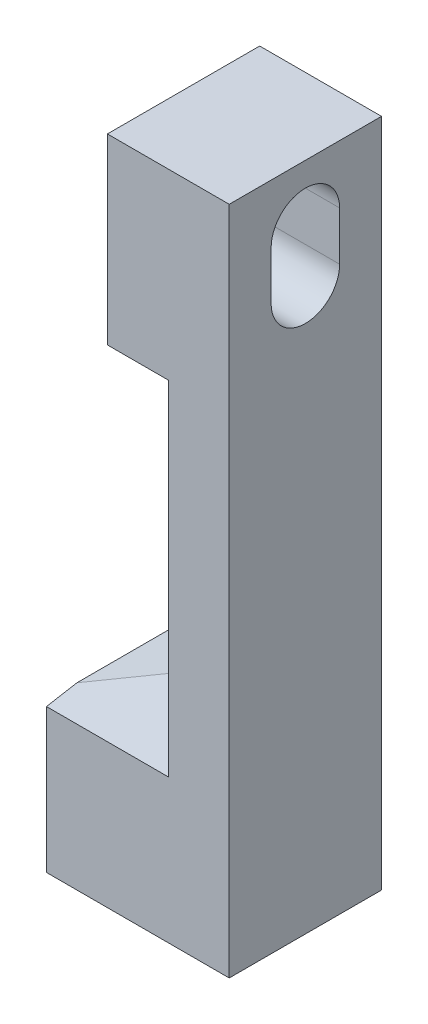
ISO-10303-21;
HEADER;
FILE_DESCRIPTION(('STEP AP214'),'2;1');
FILE_NAME('part.step','',(''),(''),'','','');
FILE_SCHEMA(('AUTOMOTIVE_DESIGN { 1 0 10303 214 1 1 1 1 }'));
ENDSEC;
DATA;
#1=APPLICATION_CONTEXT('core data for automotive mechanical design processes');
#2=APPLICATION_PROTOCOL_DEFINITION('international standard','automotive_design',2000,#1);
#3=PRODUCT_CONTEXT('',#1,'mechanical');
#4=PRODUCT('Part','Part','',(#3));
#5=PRODUCT_RELATED_PRODUCT_CATEGORY('part','',(#4));
#6=PRODUCT_DEFINITION_FORMATION('','',#4);
#7=PRODUCT_DEFINITION_CONTEXT('part definition',#1,'design');
#8=PRODUCT_DEFINITION('design','',#6,#7);
#9=PRODUCT_DEFINITION_SHAPE('','',#8);
#10=(LENGTH_UNIT() NAMED_UNIT(*) SI_UNIT(.MILLI.,.METRE.));
#11=(NAMED_UNIT(*) PLANE_ANGLE_UNIT() SI_UNIT($,.RADIAN.));
#12=(NAMED_UNIT(*) SI_UNIT($,.STERADIAN.) SOLID_ANGLE_UNIT());
#13=UNCERTAINTY_MEASURE_WITH_UNIT(LENGTH_MEASURE(1.E-05),#10,'distance_accuracy_value','');
#14=(GEOMETRIC_REPRESENTATION_CONTEXT(3) GLOBAL_UNCERTAINTY_ASSIGNED_CONTEXT((#13)) GLOBAL_UNIT_ASSIGNED_CONTEXT((#10,
#11,#12)) REPRESENTATION_CONTEXT('',''));
#15=CARTESIAN_POINT('',(0.,0.,0.));
#16=DIRECTION('',(0.,0.,1.));
#17=DIRECTION('',(1.,0.,0.));
#18=AXIS2_PLACEMENT_3D('',#15,#16,#17);
#19=CARTESIAN_POINT('',(0.,0.,0.));
#20=DIRECTION('',(1.,0.,0.));
#21=DIRECTION('',(0.,0.,-1.));
#22=AXIS2_PLACEMENT_3D('',#19,#20,#21);
#23=PLANE('',#22);
#24=DIRECTION('',(0.,1.,0.));
#25=VECTOR('',#24,1.);
#26=CARTESIAN_POINT('',(0.,34.925,-7.93749999999999));
#27=LINE('',#26,#25);
#28=CARTESIAN_POINT('',(0.,-17.145,-7.9375));
#29=VERTEX_POINT('',#28);
#30=CARTESIAN_POINT('',(0.,18.6741908187469,-7.9375));
#31=VERTEX_POINT('',#30);
#32=EDGE_CURVE('E204',#29,#31,#27,.T.);
#33=ORIENTED_EDGE('',*,*,#32,.F.);
#34=DIRECTION('',(0.,0.173648177666927,-0.984807753012208));
#35=VECTOR('',#34,1.);
#36=CARTESIAN_POINT('',(0.,-19.9441908187468,7.93750000000001));
#37=LINE('',#36,#35);
#38=CARTESIAN_POINT('',(0.,-19.9441908187468,7.93750000000001));
#39=VERTEX_POINT('',#38);
#40=EDGE_CURVE('E169',#39,#29,#37,.T.);
#41=ORIENTED_EDGE('',*,*,#40,.F.);
#42=DIRECTION('',(0.,-1.,0.));
#43=VECTOR('',#42,1.);
#44=CARTESIAN_POINT('',(0.,34.925,7.93750000000001));
#45=LINE('',#44,#43);
#46=CARTESIAN_POINT('',(0.,15.875,7.93750000000001));
#47=VERTEX_POINT('',#46);
#48=EDGE_CURVE('E209',#47,#39,#45,.T.);
#49=ORIENTED_EDGE('',*,*,#48,.F.);
#50=DIRECTION('',(0.,-0.173648177666934,0.984807753012207));
#51=VECTOR('',#50,1.);
#52=CARTESIAN_POINT('',(0.,18.6741908187469,-7.9375));
#53=LINE('',#52,#51);
#54=EDGE_CURVE('E185',#31,#47,#53,.T.);
#55=ORIENTED_EDGE('',*,*,#54,.F.);
#56=EDGE_LOOP('',(#33,#41,#49,#55));
#57=FACE_BOUND('',#56,.T.);
#58=ADVANCED_FACE('F37',(#57),#23,.F.);
#59=CARTESIAN_POINT('',(6.35,34.925,-7.93749999999999));
#60=DIRECTION('',(0.,0.,1.));
#61=DIRECTION('',(0.,-1.,0.));
#62=AXIS2_PLACEMENT_3D('',#59,#60,#61);
#63=PLANE('',#62);
#64=DIRECTION('',(0.,-1.,0.));
#65=VECTOR('',#64,1.);
#66=CARTESIAN_POINT('',(-12.7,-17.145,-7.9375));
#67=LINE('',#66,#65);
#68=CARTESIAN_POINT('',(-12.7,-19.3843526549974,-7.9375));
#69=VERTEX_POINT('',#68);
#70=CARTESIAN_POINT('',(-12.7,-34.925,-7.9375));
#71=VERTEX_POINT('',#70);
#72=EDGE_CURVE('E173',#69,#71,#67,.T.);
#73=ORIENTED_EDGE('',*,*,#72,.F.);
#74=DIRECTION('',(-0.984807753012209,-0.173648177666923,0.));
#75=VECTOR('',#74,1.);
#76=CARTESIAN_POINT('',(-12.7,-19.3843526549974,-7.9375));
#77=LINE('',#76,#75);
#78=EDGE_CURVE('E161',#29,#69,#77,.T.);
#79=ORIENTED_EDGE('',*,*,#78,.F.);
#80=ORIENTED_EDGE('',*,*,#32,.T.);
#81=DIRECTION('',(1.,0.,0.));
#82=VECTOR('',#81,1.);
#83=CARTESIAN_POINT('',(-6.35,18.6741908187469,-7.9375));
#84=LINE('',#83,#82);
#85=CARTESIAN_POINT('',(-6.35,18.6741908187469,-7.9375));
#86=VERTEX_POINT('',#85);
#87=EDGE_CURVE('E201',#86,#31,#84,.T.);
#88=ORIENTED_EDGE('',*,*,#87,.F.);
#89=DIRECTION('',(0.,-1.,0.));
#90=VECTOR('',#89,1.);
#91=CARTESIAN_POINT('',(-6.35,34.925,-7.9375));
#92=LINE('',#91,#90);
#93=CARTESIAN_POINT('',(-6.35,34.925,-7.9375));
#94=VERTEX_POINT('',#93);
#95=EDGE_CURVE('E192',#94,#86,#92,.T.);
#96=ORIENTED_EDGE('',*,*,#95,.F.);
#97=DIRECTION('',(-1.,0.,0.));
#98=VECTOR('',#97,1.);
#99=CARTESIAN_POINT('',(6.35,34.925,-7.93749999999999));
#100=LINE('',#99,#98);
#101=CARTESIAN_POINT('',(6.35,34.925,-7.93749999999999));
#102=VERTEX_POINT('',#101);
#103=EDGE_CURVE('E45',#102,#94,#100,.T.);
#104=ORIENTED_EDGE('',*,*,#103,.F.);
#105=DIRECTION('',(0.,1.,0.));
#106=VECTOR('',#105,1.);
#107=CARTESIAN_POINT('',(6.35,34.925,-7.93749999999999));
#108=LINE('',#107,#106);
#109=CARTESIAN_POINT('',(6.35,-34.925,-7.9375));
#110=VERTEX_POINT('',#109);
#111=EDGE_CURVE('E205',#110,#102,#108,.T.);
#112=ORIENTED_EDGE('',*,*,#111,.F.);
#113=DIRECTION('',(-1.,0.,0.));
#114=VECTOR('',#113,1.);
#115=CARTESIAN_POINT('',(6.35,-34.925,-7.9375));
#116=LINE('',#115,#114);
#117=EDGE_CURVE('E215',#110,#71,#116,.T.);
#118=ORIENTED_EDGE('',*,*,#117,.T.);
#119=EDGE_LOOP('',(#73,#79,#80,#88,#96,#104,#112,#118));
#120=FACE_BOUND('',#119,.T.);
#121=ADVANCED_FACE('F39',(#120),#63,.F.);
#122=CARTESIAN_POINT('',(6.35,34.925,7.93750000000001));
#123=DIRECTION('',(0.,-1.,0.));
#124=DIRECTION('',(0.,0.,-1.));
#125=AXIS2_PLACEMENT_3D('',#122,#123,#124);
#126=PLANE('',#125);
#127=ORIENTED_EDGE('',*,*,#103,.T.);
#128=DIRECTION('',(0.,0.,-1.));
#129=VECTOR('',#128,1.);
#130=CARTESIAN_POINT('',(-6.35,34.925,7.93750000000001));
#131=LINE('',#130,#129);
#132=CARTESIAN_POINT('',(-6.35,34.925,7.93750000000001));
#133=VERTEX_POINT('',#132);
#134=EDGE_CURVE('E189',#133,#94,#131,.T.);
#135=ORIENTED_EDGE('',*,*,#134,.F.);
#136=DIRECTION('',(-1.,0.,0.));
#137=VECTOR('',#136,1.);
#138=CARTESIAN_POINT('',(6.35,34.925,7.93750000000001));
#139=LINE('',#138,#137);
#140=CARTESIAN_POINT('',(6.35,34.925,7.93750000000001));
#141=VERTEX_POINT('',#140);
#142=EDGE_CURVE('E222',#141,#133,#139,.T.);
#143=ORIENTED_EDGE('',*,*,#142,.F.);
#144=DIRECTION('',(0.,0.,1.));
#145=VECTOR('',#144,1.);
#146=CARTESIAN_POINT('',(6.35,34.925,7.93750000000001));
#147=LINE('',#146,#145);
#148=EDGE_CURVE('E208',#102,#141,#147,.T.);
#149=ORIENTED_EDGE('',*,*,#148,.F.);
#150=EDGE_LOOP('',(#127,#135,#143,#149));
#151=FACE_BOUND('',#150,.T.);
#152=ADVANCED_FACE('F226',(#151),#126,.F.);
#153=CARTESIAN_POINT('',(6.35,34.925,7.93750000000001));
#154=DIRECTION('',(0.,0.,-1.));
#155=DIRECTION('',(0.,1.,0.));
#156=AXIS2_PLACEMENT_3D('',#153,#154,#155);
#157=PLANE('',#156);
#158=ORIENTED_EDGE('',*,*,#142,.T.);
#159=DIRECTION('',(0.,1.,0.));
#160=VECTOR('',#159,1.);
#161=CARTESIAN_POINT('',(-6.35,34.925,7.93750000000001));
#162=LINE('',#161,#160);
#163=CARTESIAN_POINT('',(-6.35,15.875,7.93750000000001));
#164=VERTEX_POINT('',#163);
#165=EDGE_CURVE('E186',#164,#133,#162,.T.);
#166=ORIENTED_EDGE('',*,*,#165,.F.);
#167=DIRECTION('',(1.,0.,0.));
#168=VECTOR('',#167,1.);
#169=CARTESIAN_POINT('',(-6.35,15.875,7.93750000000001));
#170=LINE('',#169,#168);
#171=EDGE_CURVE('E196',#164,#47,#170,.T.);
#172=ORIENTED_EDGE('',*,*,#171,.T.);
#173=ORIENTED_EDGE('',*,*,#48,.T.);
#174=DIRECTION('',(1.,0.,0.));
#175=VECTOR('',#174,1.);
#176=CARTESIAN_POINT('',(-12.7,-19.9441908187468,7.93750000000001));
#177=LINE('',#176,#175);
#178=CARTESIAN_POINT('',(-12.7,-19.9441908187468,7.93750000000001));
#179=VERTEX_POINT('',#178);
#180=EDGE_CURVE('E180',#179,#39,#177,.T.);
#181=ORIENTED_EDGE('',*,*,#180,.F.);
#182=DIRECTION('',(0.,1.,0.));
#183=VECTOR('',#182,1.);
#184=CARTESIAN_POINT('',(-12.7,-34.925,7.9375));
#185=LINE('',#184,#183);
#186=CARTESIAN_POINT('',(-12.7,-34.925,7.9375));
#187=VERTEX_POINT('',#186);
#188=EDGE_CURVE('E178',#187,#179,#185,.T.);
#189=ORIENTED_EDGE('',*,*,#188,.F.);
#190=DIRECTION('',(-1.,0.,0.));
#191=VECTOR('',#190,1.);
#192=CARTESIAN_POINT('',(6.35,-34.925,7.9375));
#193=LINE('',#192,#191);
#194=CARTESIAN_POINT('',(6.35,-34.925,7.9375));
#195=VERTEX_POINT('',#194);
#196=EDGE_CURVE('E220',#195,#187,#193,.T.);
#197=ORIENTED_EDGE('',*,*,#196,.F.);
#198=DIRECTION('',(0.,-1.,0.));
#199=VECTOR('',#198,1.);
#200=CARTESIAN_POINT('',(6.35,34.925,7.93750000000001));
#201=LINE('',#200,#199);
#202=EDGE_CURVE('E211',#141,#195,#201,.T.);
#203=ORIENTED_EDGE('',*,*,#202,.F.);
#204=EDGE_LOOP('',(#158,#166,#172,#173,#181,#189,#197,#203));
#205=FACE_BOUND('',#204,.T.);
#206=ADVANCED_FACE('F244',(#205),#157,.F.);
#207=CARTESIAN_POINT('',(6.35,-34.925,7.9375));
#208=DIRECTION('',(0.,1.,0.));
#209=DIRECTION('',(0.,0.,1.));
#210=AXIS2_PLACEMENT_3D('',#207,#208,#209);
#211=PLANE('',#210);
#212=ORIENTED_EDGE('',*,*,#196,.T.);
#213=DIRECTION('',(0.,0.,1.));
#214=VECTOR('',#213,1.);
#215=CARTESIAN_POINT('',(-12.7,-34.925,-7.9375));
#216=LINE('',#215,#214);
#217=EDGE_CURVE('E175',#71,#187,#216,.T.);
#218=ORIENTED_EDGE('',*,*,#217,.F.);
#219=ORIENTED_EDGE('',*,*,#117,.F.);
#220=DIRECTION('',(0.,0.,-1.));
#221=VECTOR('',#220,1.);
#222=CARTESIAN_POINT('',(6.35,-34.925,7.9375));
#223=LINE('',#222,#221);
#224=EDGE_CURVE('E213',#195,#110,#223,.T.);
#225=ORIENTED_EDGE('',*,*,#224,.F.);
#226=EDGE_LOOP('',(#212,#218,#219,#225));
#227=FACE_BOUND('',#226,.T.);
#228=ADVANCED_FACE('F252',(#227),#211,.F.);
#229=CARTESIAN_POINT('',(6.35,0.,0.));
#230=DIRECTION('',(1.,0.,0.));
#231=DIRECTION('',(0.,0.,-1.));
#232=AXIS2_PLACEMENT_3D('',#229,#230,#231);
#233=PLANE('',#232);
#234=CARTESIAN_POINT('',(6.35,28.8417379890378,0.));
#235=DIRECTION('',(-1.,0.,0.));
#236=DIRECTION('',(0.,0.,1.));
#237=AXIS2_PLACEMENT_3D('',#234,#235,#236);
#238=CIRCLE('',#237,3.5687);
#239=CARTESIAN_POINT('',(6.35,28.8417379890378,3.5687));
#240=VERTEX_POINT('',#239);
#241=CARTESIAN_POINT('',(6.35,28.8417379890378,-3.5687));
#242=VERTEX_POINT('',#241);
#243=EDGE_CURVE('E130',#240,#242,#238,.T.);
#244=ORIENTED_EDGE('',*,*,#243,.T.);
#245=DIRECTION('',(0.,-1.,0.));
#246=VECTOR('',#245,1.);
#247=CARTESIAN_POINT('',(6.35,28.8417379890378,-3.5687));
#248=LINE('',#247,#246);
#249=CARTESIAN_POINT('',(6.35,23.7617379890378,-3.5687));
#250=VERTEX_POINT('',#249);
#251=EDGE_CURVE('E139',#242,#250,#248,.T.);
#252=ORIENTED_EDGE('',*,*,#251,.T.);
#253=CARTESIAN_POINT('',(6.35,23.7617379890378,0.));
#254=DIRECTION('',(-1.,0.,0.));
#255=DIRECTION('',(0.,0.,1.));
#256=AXIS2_PLACEMENT_3D('',#253,#254,#255);
#257=CIRCLE('',#256,3.5687);
#258=CARTESIAN_POINT('',(6.35,23.7617379890378,3.5687));
#259=VERTEX_POINT('',#258);
#260=EDGE_CURVE('E52',#250,#259,#257,.T.);
#261=ORIENTED_EDGE('',*,*,#260,.T.);
#262=DIRECTION('',(0.,1.,0.));
#263=VECTOR('',#262,1.);
#264=CARTESIAN_POINT('',(6.35,28.8417379890378,3.5687));
#265=LINE('',#264,#263);
#266=EDGE_CURVE('E136',#259,#240,#265,.T.);
#267=ORIENTED_EDGE('',*,*,#266,.T.);
#268=EDGE_LOOP('',(#244,#252,#261,#267));
#269=FACE_BOUND('',#268,.T.);
#270=ORIENTED_EDGE('',*,*,#111,.T.);
#271=ORIENTED_EDGE('',*,*,#148,.T.);
#272=ORIENTED_EDGE('',*,*,#202,.T.);
#273=ORIENTED_EDGE('',*,*,#224,.T.);
#274=EDGE_LOOP('',(#270,#271,#272,#273));
#275=FACE_BOUND('',#274,.T.);
#276=ADVANCED_FACE('F143',(#269,#275),#233,.T.);
#277=CARTESIAN_POINT('',(-6.35,18.6741908187469,-7.9375));
#278=DIRECTION('',(0.,0.984807753012207,0.173648177666934));
#279=DIRECTION('',(0.,-0.173648177666934,0.984807753012208));
#280=AXIS2_PLACEMENT_3D('',#277,#278,#279);
#281=PLANE('',#280);
#282=ORIENTED_EDGE('',*,*,#54,.T.);
#283=ORIENTED_EDGE('',*,*,#171,.F.);
#284=DIRECTION('',(0.,-0.173648177666934,0.984807753012207));
#285=VECTOR('',#284,1.);
#286=CARTESIAN_POINT('',(-6.35,18.6741908187469,-7.9375));
#287=LINE('',#286,#285);
#288=EDGE_CURVE('E194',#86,#164,#287,.T.);
#289=ORIENTED_EDGE('',*,*,#288,.F.);
#290=ORIENTED_EDGE('',*,*,#87,.T.);
#291=EDGE_LOOP('',(#282,#283,#289,#290));
#292=FACE_BOUND('',#291,.T.);
#293=ADVANCED_FACE('F242',(#292),#281,.F.);
#294=CARTESIAN_POINT('',(-6.35,0.,0.));
#295=DIRECTION('',(1.,0.,0.));
#296=DIRECTION('',(0.,0.,-1.));
#297=AXIS2_PLACEMENT_3D('',#294,#295,#296);
#298=PLANE('',#297);
#299=DIRECTION('',(0.,-1.,0.));
#300=VECTOR('',#299,1.);
#301=CARTESIAN_POINT('',(-6.35,28.8417379890378,-3.5687));
#302=LINE('',#301,#300);
#303=CARTESIAN_POINT('',(-6.35,28.8417379890378,-3.5687));
#304=VERTEX_POINT('',#303);
#305=CARTESIAN_POINT('',(-6.35,23.7617379890378,-3.5687));
#306=VERTEX_POINT('',#305);
#307=EDGE_CURVE('E155',#304,#306,#302,.T.);
#308=ORIENTED_EDGE('',*,*,#307,.F.);
#309=CARTESIAN_POINT('',(-6.35,28.8417379890378,0.));
#310=DIRECTION('',(-1.,0.,0.));
#311=DIRECTION('',(0.,0.,1.));
#312=AXIS2_PLACEMENT_3D('',#309,#310,#311);
#313=CIRCLE('',#312,3.5687);
#314=CARTESIAN_POINT('',(-6.35,28.8417379890378,3.5687));
#315=VERTEX_POINT('',#314);
#316=EDGE_CURVE('E60',#315,#304,#313,.T.);
#317=ORIENTED_EDGE('',*,*,#316,.F.);
#318=DIRECTION('',(0.,1.,0.));
#319=VECTOR('',#318,1.);
#320=CARTESIAN_POINT('',(-6.35,28.8417379890378,3.5687));
#321=LINE('',#320,#319);
#322=CARTESIAN_POINT('',(-6.35,23.7617379890378,3.5687));
#323=VERTEX_POINT('',#322);
#324=EDGE_CURVE('E146',#323,#315,#321,.T.);
#325=ORIENTED_EDGE('',*,*,#324,.F.);
#326=CARTESIAN_POINT('',(-6.35,23.7617379890378,0.));
#327=DIRECTION('',(-1.,0.,0.));
#328=DIRECTION('',(0.,0.,1.));
#329=AXIS2_PLACEMENT_3D('',#326,#327,#328);
#330=CIRCLE('',#329,3.5687);
#331=EDGE_CURVE('E149',#306,#323,#330,.T.);
#332=ORIENTED_EDGE('',*,*,#331,.F.);
#333=EDGE_LOOP('',(#308,#317,#325,#332));
#334=FACE_BOUND('',#333,.T.);
#335=ORIENTED_EDGE('',*,*,#165,.T.);
#336=ORIENTED_EDGE('',*,*,#134,.T.);
#337=ORIENTED_EDGE('',*,*,#95,.T.);
#338=ORIENTED_EDGE('',*,*,#288,.T.);
#339=EDGE_LOOP('',(#335,#336,#337,#338));
#340=FACE_BOUND('',#339,.T.);
#341=ADVANCED_FACE('F232',(#334,#340),#298,.F.);
#342=CARTESIAN_POINT('',(-12.7,-19.9441908187468,7.93750000000001));
#343=DIRECTION('',(0.,-0.984807753012208,-0.173648177666927));
#344=DIRECTION('',(0.,0.173648177666927,-0.984807753012209));
#345=AXIS2_PLACEMENT_3D('',#342,#343,#344);
#346=PLANE('',#345);
#347=ORIENTED_EDGE('',*,*,#40,.T.);
#348=DIRECTION('',(-0.701673843159872,-0.12372403020648,0.701673843159856));
#349=VECTOR('',#348,1.);
#350=CARTESIAN_POINT('',(-14.3118008715954,-19.6685566361891,6.37430087159505));
#351=LINE('',#350,#349);
#352=CARTESIAN_POINT('',(-12.7,-19.3843526549974,4.76249999999972));
#353=VERTEX_POINT('',#352);
#354=EDGE_CURVE('E166',#29,#353,#351,.T.);
#355=ORIENTED_EDGE('',*,*,#354,.T.);
#356=DIRECTION('',(0.,0.173648177666927,-0.984807753012208));
#357=VECTOR('',#356,1.);
#358=CARTESIAN_POINT('',(-12.7,-19.9441908187468,7.93750000000001));
#359=LINE('',#358,#357);
#360=EDGE_CURVE('E170',#179,#353,#359,.T.);
#361=ORIENTED_EDGE('',*,*,#360,.F.);
#362=ORIENTED_EDGE('',*,*,#180,.T.);
#363=EDGE_LOOP('',(#347,#355,#361,#362));
#364=FACE_BOUND('',#363,.T.);
#365=ADVANCED_FACE('F260',(#364),#346,.F.);
#366=CARTESIAN_POINT('',(-12.7,0.,0.));
#367=DIRECTION('',(-1.,0.,0.));
#368=DIRECTION('',(0.,0.,1.));
#369=AXIS2_PLACEMENT_3D('',#366,#367,#368);
#370=PLANE('',#369);
#371=DIRECTION('',(0.,0.,1.));
#372=VECTOR('',#371,1.);
#373=CARTESIAN_POINT('',(-12.7,-19.3843526549974,0.));
#374=LINE('',#373,#372);
#375=EDGE_CURVE('E11',#69,#353,#374,.T.);
#376=ORIENTED_EDGE('',*,*,#375,.F.);
#377=ORIENTED_EDGE('',*,*,#72,.T.);
#378=ORIENTED_EDGE('',*,*,#217,.T.);
#379=ORIENTED_EDGE('',*,*,#188,.T.);
#380=ORIENTED_EDGE('',*,*,#360,.T.);
#381=EDGE_LOOP('',(#376,#377,#378,#379,#380));
#382=FACE_BOUND('',#381,.T.);
#383=ADVANCED_FACE('F255',(#382),#370,.T.);
#384=CARTESIAN_POINT('',(-12.7,-19.3843526549974,7.93750000000001));
#385=DIRECTION('',(0.173648177666924,-0.984807753012209,0.));
#386=DIRECTION('',(0.984807753012209,0.173648177666924,0.));
#387=AXIS2_PLACEMENT_3D('',#384,#385,#386);
#388=PLANE('',#387);
#389=ORIENTED_EDGE('',*,*,#78,.T.);
#390=ORIENTED_EDGE('',*,*,#375,.T.);
#391=ORIENTED_EDGE('',*,*,#354,.F.);
#392=EDGE_LOOP('',(#389,#390,#391));
#393=FACE_BOUND('',#392,.T.);
#394=ADVANCED_FACE('F262',(#393),#388,.F.);
#395=CARTESIAN_POINT('',(6.35,28.8417379890378,0.));
#396=DIRECTION('',(-1.,0.,0.));
#397=DIRECTION('',(0.,0.,1.));
#398=AXIS2_PLACEMENT_3D('',#395,#396,#397);
#399=CYLINDRICAL_SURFACE('',#398,3.5687);
#400=ORIENTED_EDGE('',*,*,#316,.T.);
#401=DIRECTION('',(-1.,0.,0.));
#402=VECTOR('',#401,1.);
#403=CARTESIAN_POINT('',(6.35,28.8417379890378,-3.5687));
#404=LINE('',#403,#402);
#405=EDGE_CURVE('E126',#242,#304,#404,.T.);
#406=ORIENTED_EDGE('',*,*,#405,.F.);
#407=ORIENTED_EDGE('',*,*,#243,.F.);
#408=DIRECTION('',(-1.,0.,0.));
#409=VECTOR('',#408,1.);
#410=CARTESIAN_POINT('',(6.35,28.8417379890378,3.5687));
#411=LINE('',#410,#409);
#412=EDGE_CURVE('E159',#240,#315,#411,.T.);
#413=ORIENTED_EDGE('',*,*,#412,.T.);
#414=EDGE_LOOP('',(#400,#406,#407,#413));
#415=FACE_BOUND('',#414,.T.);
#416=ADVANCED_FACE('F128',(#415),#399,.F.);
#417=CARTESIAN_POINT('',(6.35,28.8417379890378,3.5687));
#418=DIRECTION('',(0.,0.,1.));
#419=DIRECTION('',(1.,0.,0.));
#420=AXIS2_PLACEMENT_3D('',#417,#418,#419);
#421=PLANE('',#420);
#422=ORIENTED_EDGE('',*,*,#324,.T.);
#423=ORIENTED_EDGE('',*,*,#412,.F.);
#424=ORIENTED_EDGE('',*,*,#266,.F.);
#425=DIRECTION('',(-1.,0.,0.));
#426=VECTOR('',#425,1.);
#427=CARTESIAN_POINT('',(6.35,23.7617379890378,3.5687));
#428=LINE('',#427,#426);
#429=EDGE_CURVE('E162',#259,#323,#428,.T.);
#430=ORIENTED_EDGE('',*,*,#429,.T.);
#431=EDGE_LOOP('',(#422,#423,#424,#430));
#432=FACE_BOUND('',#431,.T.);
#433=ADVANCED_FACE('F329',(#432),#421,.F.);
#434=CARTESIAN_POINT('',(6.35,23.7617379890378,0.));
#435=DIRECTION('',(-1.,0.,0.));
#436=DIRECTION('',(0.,0.,1.));
#437=AXIS2_PLACEMENT_3D('',#434,#435,#436);
#438=CYLINDRICAL_SURFACE('',#437,3.5687);
#439=ORIENTED_EDGE('',*,*,#331,.T.);
#440=ORIENTED_EDGE('',*,*,#429,.F.);
#441=ORIENTED_EDGE('',*,*,#260,.F.);
#442=DIRECTION('',(-1.,0.,0.));
#443=VECTOR('',#442,1.);
#444=CARTESIAN_POINT('',(6.35,23.7617379890378,-3.5687));
#445=LINE('',#444,#443);
#446=EDGE_CURVE('E135',#250,#306,#445,.T.);
#447=ORIENTED_EDGE('',*,*,#446,.T.);
#448=EDGE_LOOP('',(#439,#440,#441,#447));
#449=FACE_BOUND('',#448,.T.);
#450=ADVANCED_FACE('F336',(#449),#438,.F.);
#451=CARTESIAN_POINT('',(6.35,28.8417379890378,-3.5687));
#452=DIRECTION('',(0.,0.,-1.));
#453=DIRECTION('',(0.,1.,0.));
#454=AXIS2_PLACEMENT_3D('',#451,#452,#453);
#455=PLANE('',#454);
#456=ORIENTED_EDGE('',*,*,#307,.T.);
#457=ORIENTED_EDGE('',*,*,#446,.F.);
#458=ORIENTED_EDGE('',*,*,#251,.F.);
#459=ORIENTED_EDGE('',*,*,#405,.T.);
#460=EDGE_LOOP('',(#456,#457,#458,#459));
#461=FACE_BOUND('',#460,.T.);
#462=ADVANCED_FACE('F140',(#461),#455,.F.);
#463=CLOSED_SHELL('',(#58,#121,#152,#206,#228,#276,#293,#341,#365,#383,#394,#416,#433,#450,#462));
#464=MANIFOLD_SOLID_BREP('B2',#463);
#465=ADVANCED_BREP_SHAPE_REPRESENTATION('',(#18,#464),#14);
#466=SHAPE_DEFINITION_REPRESENTATION(#9,#465);
ENDSEC;
END-ISO-10303-21;
